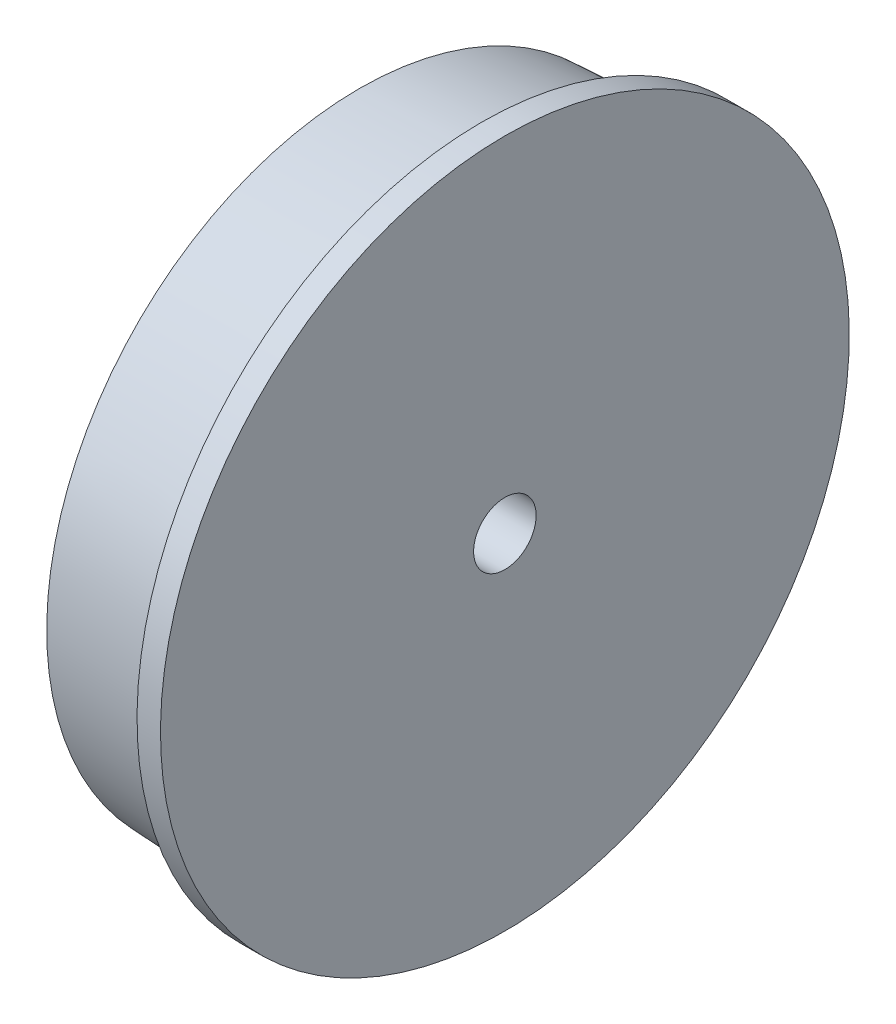
ISO-10303-21;
HEADER;
FILE_DESCRIPTION(('STEP AP214'),'2;1');
FILE_NAME('part.step','',(''),(''),'','','');
FILE_SCHEMA(('AUTOMOTIVE_DESIGN { 1 0 10303 214 1 1 1 1 }'));
ENDSEC;
DATA;
#1=APPLICATION_CONTEXT('core data for automotive mechanical design processes');
#2=APPLICATION_PROTOCOL_DEFINITION('international standard','automotive_design',2000,#1);
#3=PRODUCT_CONTEXT('',#1,'mechanical');
#4=PRODUCT('Part','Part','',(#3));
#5=PRODUCT_RELATED_PRODUCT_CATEGORY('part','',(#4));
#6=PRODUCT_DEFINITION_FORMATION('','',#4);
#7=PRODUCT_DEFINITION_CONTEXT('part definition',#1,'design');
#8=PRODUCT_DEFINITION('design','',#6,#7);
#9=PRODUCT_DEFINITION_SHAPE('','',#8);
#10=(LENGTH_UNIT() NAMED_UNIT(*) SI_UNIT(.MILLI.,.METRE.));
#11=(NAMED_UNIT(*) PLANE_ANGLE_UNIT() SI_UNIT($,.RADIAN.));
#12=(NAMED_UNIT(*) SI_UNIT($,.STERADIAN.) SOLID_ANGLE_UNIT());
#13=UNCERTAINTY_MEASURE_WITH_UNIT(LENGTH_MEASURE(1.E-05),#10,'distance_accuracy_value','');
#14=(GEOMETRIC_REPRESENTATION_CONTEXT(3) GLOBAL_UNCERTAINTY_ASSIGNED_CONTEXT((#13)) GLOBAL_UNIT_ASSIGNED_CONTEXT((#10,
#11,#12)) REPRESENTATION_CONTEXT('',''));
#15=CARTESIAN_POINT('',(0.,0.,0.));
#16=DIRECTION('',(0.,0.,1.));
#17=DIRECTION('',(1.,0.,0.));
#18=AXIS2_PLACEMENT_3D('',#15,#16,#17);
#19=CARTESIAN_POINT('',(0.,0.,0.));
#20=DIRECTION('',(1.,0.,0.));
#21=DIRECTION('',(0.,1.,0.));
#22=AXIS2_PLACEMENT_3D('',#19,#20,#21);
#23=CONICAL_SURFACE('',#22,204.087806784077,0.0523598775598232);
#24=CARTESIAN_POINT('',(-78.,0.,0.));
#25=DIRECTION('',(1.,0.,0.));
#26=DIRECTION('',(0.,1.,0.));
#27=AXIS2_PLACEMENT_3D('',#24,#25,#26);
#28=CIRCLE('',#27,200.);
#29=CARTESIAN_POINT('',(-78.,200.,0.));
#30=VERTEX_POINT('',#29);
#31=EDGE_CURVE('E41',#30,#30,#28,.T.);
#32=ORIENTED_EDGE('',*,*,#31,.T.);
#33=EDGE_LOOP('',(#32));
#34=FACE_BOUND('',#33,.T.);
#35=CARTESIAN_POINT('',(0.,0.,0.));
#36=DIRECTION('',(1.,0.,0.));
#37=DIRECTION('',(0.,1.,0.));
#38=AXIS2_PLACEMENT_3D('',#35,#36,#37);
#39=CIRCLE('',#38,204.087806784077);
#40=CARTESIAN_POINT('',(0.,204.087806784077,0.));
#41=VERTEX_POINT('',#40);
#42=EDGE_CURVE('E10',#41,#41,#39,.T.);
#43=ORIENTED_EDGE('',*,*,#42,.F.);
#44=EDGE_LOOP('',(#43));
#45=FACE_BOUND('',#44,.T.);
#46=ADVANCED_FACE('F35',(#34,#45),#23,.T.);
#47=CARTESIAN_POINT('',(-78.,0.,0.));
#48=DIRECTION('',(-1.,0.,0.));
#49=DIRECTION('',(0.,-1.,0.));
#50=AXIS2_PLACEMENT_3D('',#47,#48,#49);
#51=PLANE('',#50);
#52=CARTESIAN_POINT('',(-78.,0.,0.));
#53=DIRECTION('',(-1.,0.,0.));
#54=DIRECTION('',(0.,-1.,0.));
#55=AXIS2_PLACEMENT_3D('',#52,#53,#54);
#56=CIRCLE('',#55,20.);
#57=CARTESIAN_POINT('',(-78.,-20.,0.));
#58=VERTEX_POINT('',#57);
#59=EDGE_CURVE('E45',#58,#58,#56,.T.);
#60=ORIENTED_EDGE('',*,*,#59,.F.);
#61=EDGE_LOOP('',(#60));
#62=FACE_BOUND('',#61,.T.);
#63=ORIENTED_EDGE('',*,*,#31,.F.);
#64=EDGE_LOOP('',(#63));
#65=FACE_BOUND('',#64,.T.);
#66=ADVANCED_FACE('F67',(#62,#65),#51,.T.);
#67=CARTESIAN_POINT('',(0.,0.,0.));
#68=DIRECTION('',(-1.,0.,0.));
#69=DIRECTION('',(0.,-1.,0.));
#70=AXIS2_PLACEMENT_3D('',#67,#68,#69);
#71=CYLINDRICAL_SURFACE('',#70,20.);
#72=ORIENTED_EDGE('',*,*,#59,.T.);
#73=EDGE_LOOP('',(#72));
#74=FACE_BOUND('',#73,.T.);
#75=CARTESIAN_POINT('',(15.,0.,0.));
#76=DIRECTION('',(1.,0.,0.));
#77=DIRECTION('',(0.,1.,0.));
#78=AXIS2_PLACEMENT_3D('',#75,#76,#77);
#79=CIRCLE('',#78,20.);
#80=CARTESIAN_POINT('',(15.,20.,0.));
#81=VERTEX_POINT('',#80);
#82=EDGE_CURVE('E55',#81,#81,#79,.F.);
#83=ORIENTED_EDGE('',*,*,#82,.F.);
#84=EDGE_LOOP('',(#83));
#85=FACE_BOUND('',#84,.T.);
#86=ADVANCED_FACE('F64',(#74,#85),#71,.F.);
#87=CARTESIAN_POINT('',(15.,0.,0.));
#88=DIRECTION('',(-1.,0.,0.));
#89=DIRECTION('',(0.,-1.,0.));
#90=AXIS2_PLACEMENT_3D('',#87,#88,#89);
#91=CYLINDRICAL_SURFACE('',#90,220.251631170486);
#92=CARTESIAN_POINT('',(15.,0.,0.));
#93=DIRECTION('',(1.,0.,0.));
#94=DIRECTION('',(0.,1.,0.));
#95=AXIS2_PLACEMENT_3D('',#92,#93,#94);
#96=CIRCLE('',#95,220.251631170486);
#97=CARTESIAN_POINT('',(15.,220.251631170486,0.));
#98=VERTEX_POINT('',#97);
#99=EDGE_CURVE('E49',#98,#98,#96,.T.);
#100=ORIENTED_EDGE('',*,*,#99,.F.);
#101=EDGE_LOOP('',(#100));
#102=FACE_BOUND('',#101,.T.);
#103=CARTESIAN_POINT('',(0.,0.,0.));
#104=DIRECTION('',(1.,0.,0.));
#105=DIRECTION('',(0.,1.,0.));
#106=AXIS2_PLACEMENT_3D('',#103,#104,#105);
#107=CIRCLE('',#106,220.251631170486);
#108=CARTESIAN_POINT('',(0.,220.251631170486,0.));
#109=VERTEX_POINT('',#108);
#110=EDGE_CURVE('E52',#109,#109,#107,.T.);
#111=ORIENTED_EDGE('',*,*,#110,.T.);
#112=EDGE_LOOP('',(#111));
#113=FACE_BOUND('',#112,.T.);
#114=ADVANCED_FACE('F66',(#102,#113),#91,.T.);
#115=CARTESIAN_POINT('',(15.,0.,0.));
#116=DIRECTION('',(1.,0.,0.));
#117=DIRECTION('',(0.,1.,0.));
#118=AXIS2_PLACEMENT_3D('',#115,#116,#117);
#119=PLANE('',#118);
#120=ORIENTED_EDGE('',*,*,#82,.T.);
#121=EDGE_LOOP('',(#120));
#122=FACE_BOUND('',#121,.T.);
#123=ORIENTED_EDGE('',*,*,#99,.T.);
#124=EDGE_LOOP('',(#123));
#125=FACE_BOUND('',#124,.T.);
#126=ADVANCED_FACE('F61',(#122,#125),#119,.T.);
#127=CARTESIAN_POINT('',(0.,0.,0.));
#128=DIRECTION('',(1.,0.,0.));
#129=DIRECTION('',(0.,1.,0.));
#130=AXIS2_PLACEMENT_3D('',#127,#128,#129);
#131=PLANE('',#130);
#132=ORIENTED_EDGE('',*,*,#42,.T.);
#133=EDGE_LOOP('',(#132));
#134=FACE_BOUND('',#133,.T.);
#135=ORIENTED_EDGE('',*,*,#110,.F.);
#136=EDGE_LOOP('',(#135));
#137=FACE_BOUND('',#136,.T.);
#138=ADVANCED_FACE('F107',(#134,#137),#131,.F.);
#139=CLOSED_SHELL('',(#46,#66,#86,#114,#126,#138));
#140=MANIFOLD_SOLID_BREP('B2',#139);
#141=ADVANCED_BREP_SHAPE_REPRESENTATION('',(#18,#140),#14);
#142=SHAPE_DEFINITION_REPRESENTATION(#9,#141);
ENDSEC;
END-ISO-10303-21;
